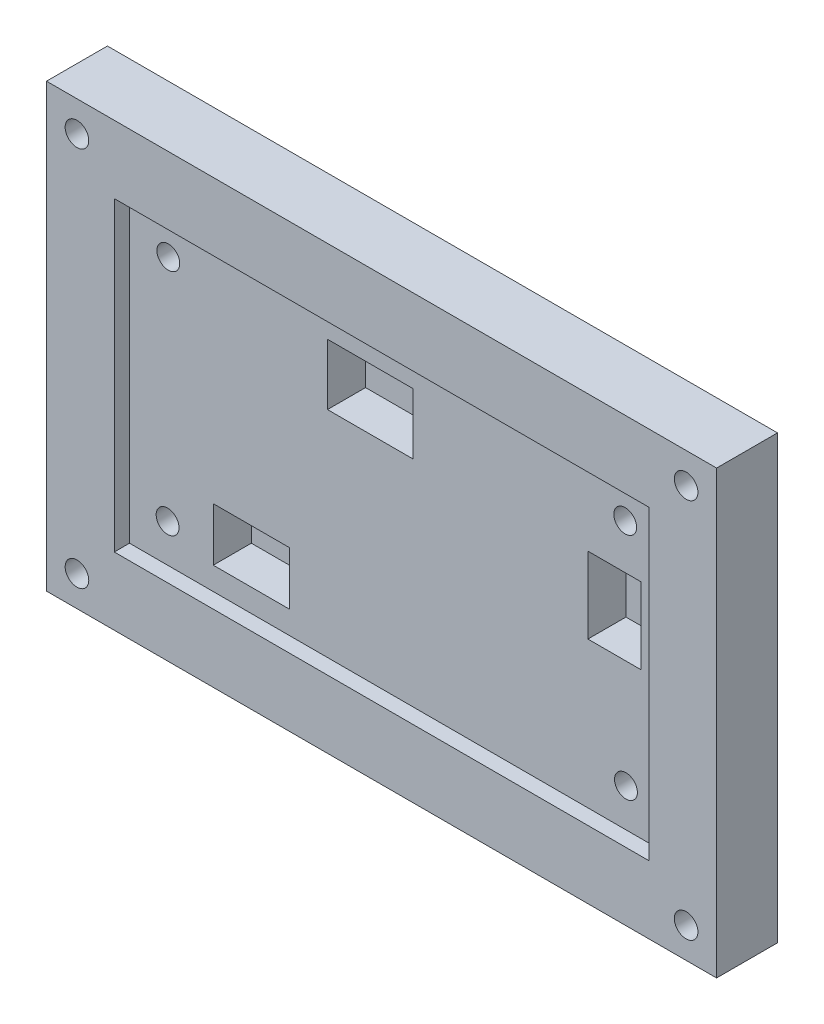
ISO-10303-21;
HEADER;
FILE_DESCRIPTION(('STEP AP214'),'2;1');
FILE_NAME('part.step','',(''),(''),'','','');
FILE_SCHEMA(('AUTOMOTIVE_DESIGN { 1 0 10303 214 1 1 1 1 }'));
ENDSEC;
DATA;
#1=APPLICATION_CONTEXT('core data for automotive mechanical design processes');
#2=APPLICATION_PROTOCOL_DEFINITION('international standard','automotive_design',2000,#1);
#3=PRODUCT_CONTEXT('',#1,'mechanical');
#4=PRODUCT('Part','Part','',(#3));
#5=PRODUCT_RELATED_PRODUCT_CATEGORY('part','',(#4));
#6=PRODUCT_DEFINITION_FORMATION('','',#4);
#7=PRODUCT_DEFINITION_CONTEXT('part definition',#1,'design');
#8=PRODUCT_DEFINITION('design','',#6,#7);
#9=PRODUCT_DEFINITION_SHAPE('','',#8);
#10=(LENGTH_UNIT() NAMED_UNIT(*) SI_UNIT(.MILLI.,.METRE.));
#11=(NAMED_UNIT(*) PLANE_ANGLE_UNIT() SI_UNIT($,.RADIAN.));
#12=(NAMED_UNIT(*) SI_UNIT($,.STERADIAN.) SOLID_ANGLE_UNIT());
#13=UNCERTAINTY_MEASURE_WITH_UNIT(LENGTH_MEASURE(1.E-05),#10,'distance_accuracy_value','');
#14=(GEOMETRIC_REPRESENTATION_CONTEXT(3) GLOBAL_UNCERTAINTY_ASSIGNED_CONTEXT((#13)) GLOBAL_UNIT_ASSIGNED_CONTEXT((#10,
#11,#12)) REPRESENTATION_CONTEXT('',''));
#15=CARTESIAN_POINT('',(0.,0.,0.));
#16=DIRECTION('',(0.,0.,1.));
#17=DIRECTION('',(1.,0.,0.));
#18=AXIS2_PLACEMENT_3D('',#15,#16,#17);
#19=CARTESIAN_POINT('',(0.,0.,8.));
#20=DIRECTION('',(0.,0.,1.));
#21=DIRECTION('',(1.,0.,0.));
#22=AXIS2_PLACEMENT_3D('',#19,#20,#21);
#23=PLANE('',#22);
#24=DIRECTION('',(-1.,0.,0.));
#25=VECTOR('',#24,1.);
#26=CARTESIAN_POINT('',(79.1,49.1,8.));
#27=LINE('',#26,#25);
#28=CARTESIAN_POINT('',(79.1,49.1,8.));
#29=VERTEX_POINT('',#28);
#30=CARTESIAN_POINT('',(8.9,49.1,8.));
#31=VERTEX_POINT('',#30);
#32=EDGE_CURVE('E297',#29,#31,#27,.T.);
#33=ORIENTED_EDGE('',*,*,#32,.F.);
#34=DIRECTION('',(0.,1.,0.));
#35=VECTOR('',#34,1.);
#36=CARTESIAN_POINT('',(79.1,8.9,8.));
#37=LINE('',#36,#35);
#38=CARTESIAN_POINT('',(79.1,8.9,8.));
#39=VERTEX_POINT('',#38);
#40=EDGE_CURVE('E304',#39,#29,#37,.T.);
#41=ORIENTED_EDGE('',*,*,#40,.F.);
#42=DIRECTION('',(1.,0.,0.));
#43=VECTOR('',#42,1.);
#44=CARTESIAN_POINT('',(8.9,8.9,8.));
#45=LINE('',#44,#43);
#46=CARTESIAN_POINT('',(8.9,8.9,8.));
#47=VERTEX_POINT('',#46);
#48=EDGE_CURVE('E318',#47,#39,#45,.T.);
#49=ORIENTED_EDGE('',*,*,#48,.F.);
#50=DIRECTION('',(0.,-1.,0.));
#51=VECTOR('',#50,1.);
#52=CARTESIAN_POINT('',(8.9,49.1,8.));
#53=LINE('',#52,#51);
#54=EDGE_CURVE('E315',#31,#47,#53,.T.);
#55=ORIENTED_EDGE('',*,*,#54,.F.);
#56=EDGE_LOOP('',(#33,#41,#49,#55));
#57=FACE_BOUND('',#56,.T.);
#58=CARTESIAN_POINT('',(84.,4.00000000000001,8.));
#59=DIRECTION('',(0.,0.,1.));
#60=DIRECTION('',(-1.,0.,0.));
#61=AXIS2_PLACEMENT_3D('',#58,#59,#60);
#62=CIRCLE('',#61,1.54999999999999);
#63=CARTESIAN_POINT('',(82.45,4.00000000000001,8.));
#64=VERTEX_POINT('',#63);
#65=EDGE_CURVE('E338',#64,#64,#62,.T.);
#66=ORIENTED_EDGE('',*,*,#65,.F.);
#67=EDGE_LOOP('',(#66));
#68=FACE_BOUND('',#67,.T.);
#69=CARTESIAN_POINT('',(4.00000000000001,4.,8.));
#70=DIRECTION('',(0.,0.,1.));
#71=DIRECTION('',(1.,0.,0.));
#72=AXIS2_PLACEMENT_3D('',#69,#70,#71);
#73=CIRCLE('',#72,1.55);
#74=CARTESIAN_POINT('',(5.55000000000001,4.,8.));
#75=VERTEX_POINT('',#74);
#76=EDGE_CURVE('E350',#75,#75,#73,.T.);
#77=ORIENTED_EDGE('',*,*,#76,.F.);
#78=EDGE_LOOP('',(#77));
#79=FACE_BOUND('',#78,.T.);
#80=DIRECTION('',(0.,-1.,0.));
#81=VECTOR('',#80,1.);
#82=CARTESIAN_POINT('',(0.,58.,8.));
#83=LINE('',#82,#81);
#84=CARTESIAN_POINT('',(0.,58.,8.));
#85=VERTEX_POINT('',#84);
#86=CARTESIAN_POINT('',(0.,0.,8.));
#87=VERTEX_POINT('',#86);
#88=EDGE_CURVE('E356',#85,#87,#83,.T.);
#89=ORIENTED_EDGE('',*,*,#88,.T.);
#90=DIRECTION('',(1.,0.,0.));
#91=VECTOR('',#90,1.);
#92=CARTESIAN_POINT('',(0.,0.,8.));
#93=LINE('',#92,#91);
#94=CARTESIAN_POINT('',(88.,0.,8.));
#95=VERTEX_POINT('',#94);
#96=EDGE_CURVE('E359',#87,#95,#93,.T.);
#97=ORIENTED_EDGE('',*,*,#96,.T.);
#98=DIRECTION('',(0.,1.,0.));
#99=VECTOR('',#98,1.);
#100=CARTESIAN_POINT('',(88.,58.,8.));
#101=LINE('',#100,#99);
#102=CARTESIAN_POINT('',(88.,58.,8.));
#103=VERTEX_POINT('',#102);
#104=EDGE_CURVE('E362',#95,#103,#101,.T.);
#105=ORIENTED_EDGE('',*,*,#104,.T.);
#106=DIRECTION('',(-1.,0.,0.));
#107=VECTOR('',#106,1.);
#108=CARTESIAN_POINT('',(0.,58.,8.));
#109=LINE('',#108,#107);
#110=EDGE_CURVE('E364',#103,#85,#109,.T.);
#111=ORIENTED_EDGE('',*,*,#110,.T.);
#112=EDGE_LOOP('',(#89,#97,#105,#111));
#113=FACE_BOUND('',#112,.T.);
#114=CARTESIAN_POINT('',(4.00000000000001,54.,8.));
#115=DIRECTION('',(0.,0.,1.));
#116=DIRECTION('',(-1.,0.,0.));
#117=AXIS2_PLACEMENT_3D('',#114,#115,#116);
#118=CIRCLE('',#117,1.55);
#119=CARTESIAN_POINT('',(2.45000000000001,54.,8.));
#120=VERTEX_POINT('',#119);
#121=EDGE_CURVE('E344',#120,#120,#118,.T.);
#122=ORIENTED_EDGE('',*,*,#121,.F.);
#123=EDGE_LOOP('',(#122));
#124=FACE_BOUND('',#123,.T.);
#125=CARTESIAN_POINT('',(84.,54.,8.));
#126=DIRECTION('',(0.,0.,1.));
#127=DIRECTION('',(1.,0.,0.));
#128=AXIS2_PLACEMENT_3D('',#125,#126,#127);
#129=CIRCLE('',#128,1.54999999999999);
#130=CARTESIAN_POINT('',(85.55,54.,8.));
#131=VERTEX_POINT('',#130);
#132=EDGE_CURVE('E332',#131,#131,#129,.T.);
#133=ORIENTED_EDGE('',*,*,#132,.F.);
#134=EDGE_LOOP('',(#133));
#135=FACE_BOUND('',#134,.T.);
#136=ADVANCED_FACE('F41',(#57,#68,#79,#113,#124,#135),#23,.T.);
#137=CARTESIAN_POINT('',(0.,0.,0.));
#138=DIRECTION('',(0.,0.,1.));
#139=DIRECTION('',(1.,0.,0.));
#140=AXIS2_PLACEMENT_3D('',#137,#138,#139);
#141=PLANE('',#140);
#142=DIRECTION('',(0.,-1.,0.));
#143=VECTOR('',#142,1.);
#144=CARTESIAN_POINT('',(0.,58.,0.));
#145=LINE('',#144,#143);
#146=CARTESIAN_POINT('',(0.,58.,0.));
#147=VERTEX_POINT('',#146);
#148=CARTESIAN_POINT('',(0.,0.,0.));
#149=VERTEX_POINT('',#148);
#150=EDGE_CURVE('E353',#147,#149,#145,.T.);
#151=ORIENTED_EDGE('',*,*,#150,.F.);
#152=DIRECTION('',(-1.,0.,0.));
#153=VECTOR('',#152,1.);
#154=CARTESIAN_POINT('',(0.,58.,0.));
#155=LINE('',#154,#153);
#156=CARTESIAN_POINT('',(88.,58.,0.));
#157=VERTEX_POINT('',#156);
#158=EDGE_CURVE('E360',#157,#147,#155,.T.);
#159=ORIENTED_EDGE('',*,*,#158,.F.);
#160=DIRECTION('',(0.,1.,0.));
#161=VECTOR('',#160,1.);
#162=CARTESIAN_POINT('',(88.,58.,0.));
#163=LINE('',#162,#161);
#164=CARTESIAN_POINT('',(88.,0.,0.));
#165=VERTEX_POINT('',#164);
#166=EDGE_CURVE('E371',#165,#157,#163,.T.);
#167=ORIENTED_EDGE('',*,*,#166,.F.);
#168=DIRECTION('',(1.,0.,0.));
#169=VECTOR('',#168,1.);
#170=CARTESIAN_POINT('',(0.,0.,0.));
#171=LINE('',#170,#169);
#172=EDGE_CURVE('E369',#149,#165,#171,.T.);
#173=ORIENTED_EDGE('',*,*,#172,.F.);
#174=EDGE_LOOP('',(#151,#159,#167,#173));
#175=FACE_BOUND('',#174,.T.);
#176=CARTESIAN_POINT('',(4.00000000000001,4.,0.));
#177=DIRECTION('',(0.,0.,1.));
#178=DIRECTION('',(1.,0.,0.));
#179=AXIS2_PLACEMENT_3D('',#176,#177,#178);
#180=CIRCLE('',#179,1.55);
#181=CARTESIAN_POINT('',(5.55000000000001,4.,0.));
#182=VERTEX_POINT('',#181);
#183=EDGE_CURVE('E347',#182,#182,#180,.T.);
#184=ORIENTED_EDGE('',*,*,#183,.T.);
#185=EDGE_LOOP('',(#184));
#186=FACE_BOUND('',#185,.T.);
#187=CARTESIAN_POINT('',(4.00000000000001,54.,0.));
#188=DIRECTION('',(0.,0.,1.));
#189=DIRECTION('',(-1.,0.,0.));
#190=AXIS2_PLACEMENT_3D('',#187,#188,#189);
#191=CIRCLE('',#190,1.55);
#192=CARTESIAN_POINT('',(2.45000000000001,54.,0.));
#193=VERTEX_POINT('',#192);
#194=EDGE_CURVE('E341',#193,#193,#191,.T.);
#195=ORIENTED_EDGE('',*,*,#194,.T.);
#196=EDGE_LOOP('',(#195));
#197=FACE_BOUND('',#196,.T.);
#198=CARTESIAN_POINT('',(84.,4.00000000000001,0.));
#199=DIRECTION('',(0.,0.,1.));
#200=DIRECTION('',(-1.,0.,0.));
#201=AXIS2_PLACEMENT_3D('',#198,#199,#200);
#202=CIRCLE('',#201,1.54999999999999);
#203=CARTESIAN_POINT('',(82.45,4.00000000000001,0.));
#204=VERTEX_POINT('',#203);
#205=EDGE_CURVE('E335',#204,#204,#202,.T.);
#206=ORIENTED_EDGE('',*,*,#205,.T.);
#207=EDGE_LOOP('',(#206));
#208=FACE_BOUND('',#207,.T.);
#209=CARTESIAN_POINT('',(84.,54.,0.));
#210=DIRECTION('',(0.,0.,1.));
#211=DIRECTION('',(1.,0.,0.));
#212=AXIS2_PLACEMENT_3D('',#209,#210,#211);
#213=CIRCLE('',#212,1.54999999999999);
#214=CARTESIAN_POINT('',(85.55,54.,0.));
#215=VERTEX_POINT('',#214);
#216=EDGE_CURVE('E325',#215,#215,#213,.T.);
#217=ORIENTED_EDGE('',*,*,#216,.T.);
#218=EDGE_LOOP('',(#217));
#219=FACE_BOUND('',#218,.T.);
#220=ADVANCED_FACE('F389',(#175,#186,#197,#208,#219),#141,.F.);
#221=CARTESIAN_POINT('',(0.,58.,8.));
#222=DIRECTION('',(1.,0.,0.));
#223=DIRECTION('',(0.,1.,0.));
#224=AXIS2_PLACEMENT_3D('',#221,#222,#223);
#225=PLANE('',#224);
#226=ORIENTED_EDGE('',*,*,#150,.T.);
#227=DIRECTION('',(0.,0.,-1.));
#228=VECTOR('',#227,1.);
#229=CARTESIAN_POINT('',(0.,0.,8.));
#230=LINE('',#229,#228);
#231=EDGE_CURVE('E11',#87,#149,#230,.T.);
#232=ORIENTED_EDGE('',*,*,#231,.F.);
#233=ORIENTED_EDGE('',*,*,#88,.F.);
#234=DIRECTION('',(0.,0.,-1.));
#235=VECTOR('',#234,1.);
#236=CARTESIAN_POINT('',(0.,58.,8.));
#237=LINE('',#236,#235);
#238=EDGE_CURVE('E366',#85,#147,#237,.T.);
#239=ORIENTED_EDGE('',*,*,#238,.T.);
#240=EDGE_LOOP('',(#226,#232,#233,#239));
#241=FACE_BOUND('',#240,.T.);
#242=ADVANCED_FACE('F43',(#241),#225,.F.);
#243=CARTESIAN_POINT('',(0.,0.,8.));
#244=DIRECTION('',(0.,1.,0.));
#245=DIRECTION('',(0.,0.,1.));
#246=AXIS2_PLACEMENT_3D('',#243,#244,#245);
#247=PLANE('',#246);
#248=ORIENTED_EDGE('',*,*,#172,.T.);
#249=DIRECTION('',(0.,0.,-1.));
#250=VECTOR('',#249,1.);
#251=CARTESIAN_POINT('',(88.,0.,8.));
#252=LINE('',#251,#250);
#253=EDGE_CURVE('E49',#95,#165,#252,.T.);
#254=ORIENTED_EDGE('',*,*,#253,.F.);
#255=ORIENTED_EDGE('',*,*,#96,.F.);
#256=ORIENTED_EDGE('',*,*,#231,.T.);
#257=EDGE_LOOP('',(#248,#254,#255,#256));
#258=FACE_BOUND('',#257,.T.);
#259=ADVANCED_FACE('F400',(#258),#247,.F.);
#260=CARTESIAN_POINT('',(88.,58.,8.));
#261=DIRECTION('',(-1.,0.,0.));
#262=DIRECTION('',(0.,0.,1.));
#263=AXIS2_PLACEMENT_3D('',#260,#261,#262);
#264=PLANE('',#263);
#265=ORIENTED_EDGE('',*,*,#166,.T.);
#266=DIRECTION('',(0.,0.,-1.));
#267=VECTOR('',#266,1.);
#268=CARTESIAN_POINT('',(88.,58.,8.));
#269=LINE('',#268,#267);
#270=EDGE_CURVE('E376',#103,#157,#269,.T.);
#271=ORIENTED_EDGE('',*,*,#270,.F.);
#272=ORIENTED_EDGE('',*,*,#104,.F.);
#273=ORIENTED_EDGE('',*,*,#253,.T.);
#274=EDGE_LOOP('',(#265,#271,#272,#273));
#275=FACE_BOUND('',#274,.T.);
#276=ADVANCED_FACE('F383',(#275),#264,.F.);
#277=CARTESIAN_POINT('',(0.,58.,8.));
#278=DIRECTION('',(0.,-1.,0.));
#279=DIRECTION('',(0.,0.,-1.));
#280=AXIS2_PLACEMENT_3D('',#277,#278,#279);
#281=PLANE('',#280);
#282=ORIENTED_EDGE('',*,*,#158,.T.);
#283=ORIENTED_EDGE('',*,*,#238,.F.);
#284=ORIENTED_EDGE('',*,*,#110,.F.);
#285=ORIENTED_EDGE('',*,*,#270,.T.);
#286=EDGE_LOOP('',(#282,#283,#284,#285));
#287=FACE_BOUND('',#286,.T.);
#288=ADVANCED_FACE('F393',(#287),#281,.F.);
#289=CARTESIAN_POINT('',(4.00000000000001,4.,8.));
#290=DIRECTION('',(0.,0.,-1.));
#291=DIRECTION('',(-1.,0.,0.));
#292=AXIS2_PLACEMENT_3D('',#289,#290,#291);
#293=CYLINDRICAL_SURFACE('',#292,1.55);
#294=ORIENTED_EDGE('',*,*,#76,.T.);
#295=EDGE_LOOP('',(#294));
#296=FACE_BOUND('',#295,.T.);
#297=ORIENTED_EDGE('',*,*,#183,.F.);
#298=EDGE_LOOP('',(#297));
#299=FACE_BOUND('',#298,.T.);
#300=ADVANCED_FACE('F419',(#296,#299),#293,.F.);
#301=CARTESIAN_POINT('',(4.00000000000001,54.,8.));
#302=DIRECTION('',(0.,0.,-1.));
#303=DIRECTION('',(-1.,0.,0.));
#304=AXIS2_PLACEMENT_3D('',#301,#302,#303);
#305=CYLINDRICAL_SURFACE('',#304,1.55);
#306=ORIENTED_EDGE('',*,*,#121,.T.);
#307=EDGE_LOOP('',(#306));
#308=FACE_BOUND('',#307,.T.);
#309=ORIENTED_EDGE('',*,*,#194,.F.);
#310=EDGE_LOOP('',(#309));
#311=FACE_BOUND('',#310,.T.);
#312=ADVANCED_FACE('F426',(#308,#311),#305,.F.);
#313=CARTESIAN_POINT('',(84.,4.00000000000001,8.));
#314=DIRECTION('',(0.,0.,-1.));
#315=DIRECTION('',(-1.,0.,0.));
#316=AXIS2_PLACEMENT_3D('',#313,#314,#315);
#317=CYLINDRICAL_SURFACE('',#316,1.54999999999999);
#318=ORIENTED_EDGE('',*,*,#65,.T.);
#319=EDGE_LOOP('',(#318));
#320=FACE_BOUND('',#319,.T.);
#321=ORIENTED_EDGE('',*,*,#205,.F.);
#322=EDGE_LOOP('',(#321));
#323=FACE_BOUND('',#322,.T.);
#324=ADVANCED_FACE('F431',(#320,#323),#317,.F.);
#325=CARTESIAN_POINT('',(84.,54.,8.));
#326=DIRECTION('',(0.,0.,-1.));
#327=DIRECTION('',(-1.,0.,0.));
#328=AXIS2_PLACEMENT_3D('',#325,#326,#327);
#329=CYLINDRICAL_SURFACE('',#328,1.54999999999999);
#330=ORIENTED_EDGE('',*,*,#132,.T.);
#331=EDGE_LOOP('',(#330));
#332=FACE_BOUND('',#331,.T.);
#333=ORIENTED_EDGE('',*,*,#216,.F.);
#334=EDGE_LOOP('',(#333));
#335=FACE_BOUND('',#334,.T.);
#336=ADVANCED_FACE('F443',(#332,#335),#329,.F.);
#337=CARTESIAN_POINT('',(79.1,49.1,6.));
#338=DIRECTION('',(0.,1.,0.));
#339=DIRECTION('',(0.,0.,1.));
#340=AXIS2_PLACEMENT_3D('',#337,#338,#339);
#341=PLANE('',#340);
#342=ORIENTED_EDGE('',*,*,#32,.T.);
#343=DIRECTION('',(0.,0.,1.));
#344=VECTOR('',#343,1.);
#345=CARTESIAN_POINT('',(8.9,49.1,6.));
#346=LINE('',#345,#344);
#347=CARTESIAN_POINT('',(8.9,49.1,6.));
#348=VERTEX_POINT('',#347);
#349=EDGE_CURVE('E313',#348,#31,#346,.T.);
#350=ORIENTED_EDGE('',*,*,#349,.F.);
#351=DIRECTION('',(-1.,0.,0.));
#352=VECTOR('',#351,1.);
#353=CARTESIAN_POINT('',(79.1,49.1,6.));
#354=LINE('',#353,#352);
#355=CARTESIAN_POINT('',(79.1,49.1,6.));
#356=VERTEX_POINT('',#355);
#357=EDGE_CURVE('E300',#356,#348,#354,.T.);
#358=ORIENTED_EDGE('',*,*,#357,.F.);
#359=DIRECTION('',(0.,0.,1.));
#360=VECTOR('',#359,1.);
#361=CARTESIAN_POINT('',(79.1,49.1,6.));
#362=LINE('',#361,#360);
#363=EDGE_CURVE('E323',#356,#29,#362,.T.);
#364=ORIENTED_EDGE('',*,*,#363,.T.);
#365=EDGE_LOOP('',(#342,#350,#358,#364));
#366=FACE_BOUND('',#365,.T.);
#367=ADVANCED_FACE('F444',(#366),#341,.F.);
#368=CARTESIAN_POINT('',(79.1,8.9,6.));
#369=DIRECTION('',(1.,0.,0.));
#370=DIRECTION('',(0.,0.,-1.));
#371=AXIS2_PLACEMENT_3D('',#368,#369,#370);
#372=PLANE('',#371);
#373=ORIENTED_EDGE('',*,*,#40,.T.);
#374=ORIENTED_EDGE('',*,*,#363,.F.);
#375=DIRECTION('',(0.,1.,0.));
#376=VECTOR('',#375,1.);
#377=CARTESIAN_POINT('',(79.1,8.9,6.));
#378=LINE('',#377,#376);
#379=CARTESIAN_POINT('',(79.1,8.9,6.));
#380=VERTEX_POINT('',#379);
#381=EDGE_CURVE('E310',#380,#356,#378,.T.);
#382=ORIENTED_EDGE('',*,*,#381,.F.);
#383=DIRECTION('',(0.,0.,1.));
#384=VECTOR('',#383,1.);
#385=CARTESIAN_POINT('',(79.1,8.9,6.));
#386=LINE('',#385,#384);
#387=EDGE_CURVE('E326',#380,#39,#386,.T.);
#388=ORIENTED_EDGE('',*,*,#387,.T.);
#389=EDGE_LOOP('',(#373,#374,#382,#388));
#390=FACE_BOUND('',#389,.T.);
#391=ADVANCED_FACE('F450',(#390),#372,.F.);
#392=CARTESIAN_POINT('',(8.9,8.9,6.));
#393=DIRECTION('',(0.,-1.,0.));
#394=DIRECTION('',(0.,0.,-1.));
#395=AXIS2_PLACEMENT_3D('',#392,#393,#394);
#396=PLANE('',#395);
#397=ORIENTED_EDGE('',*,*,#48,.T.);
#398=ORIENTED_EDGE('',*,*,#387,.F.);
#399=DIRECTION('',(1.,0.,0.));
#400=VECTOR('',#399,1.);
#401=CARTESIAN_POINT('',(8.9,8.9,6.));
#402=LINE('',#401,#400);
#403=CARTESIAN_POINT('',(8.9,8.9,6.));
#404=VERTEX_POINT('',#403);
#405=EDGE_CURVE('E307',#404,#380,#402,.T.);
#406=ORIENTED_EDGE('',*,*,#405,.F.);
#407=DIRECTION('',(0.,0.,1.));
#408=VECTOR('',#407,1.);
#409=CARTESIAN_POINT('',(8.9,8.9,6.));
#410=LINE('',#409,#408);
#411=EDGE_CURVE('E328',#404,#47,#410,.T.);
#412=ORIENTED_EDGE('',*,*,#411,.T.);
#413=EDGE_LOOP('',(#397,#398,#406,#412));
#414=FACE_BOUND('',#413,.T.);
#415=ADVANCED_FACE('F459',(#414),#396,.F.);
#416=CARTESIAN_POINT('',(8.9,49.1,6.));
#417=DIRECTION('',(-1.,0.,0.));
#418=DIRECTION('',(0.,-1.,0.));
#419=AXIS2_PLACEMENT_3D('',#416,#417,#418);
#420=PLANE('',#419);
#421=ORIENTED_EDGE('',*,*,#54,.T.);
#422=ORIENTED_EDGE('',*,*,#411,.F.);
#423=DIRECTION('',(0.,-1.,0.));
#424=VECTOR('',#423,1.);
#425=CARTESIAN_POINT('',(8.9,49.1,6.));
#426=LINE('',#425,#424);
#427=EDGE_CURVE('E303',#348,#404,#426,.T.);
#428=ORIENTED_EDGE('',*,*,#427,.F.);
#429=ORIENTED_EDGE('',*,*,#349,.T.);
#430=EDGE_LOOP('',(#421,#422,#428,#429));
#431=FACE_BOUND('',#430,.T.);
#432=ADVANCED_FACE('F456',(#431),#420,.F.);
#433=CARTESIAN_POINT('',(0.,0.,6.));
#434=DIRECTION('',(0.,0.,1.));
#435=DIRECTION('',(1.,0.,0.));
#436=AXIS2_PLACEMENT_3D('',#433,#434,#435);
#437=PLANE('',#436);
#438=DIRECTION('',(0.,-1.,0.));
#439=VECTOR('',#438,1.);
#440=CARTESIAN_POINT('',(19.9,18.9,6.));
#441=LINE('',#440,#439);
#442=CARTESIAN_POINT('',(19.9,18.9,6.));
#443=VERTEX_POINT('',#442);
#444=CARTESIAN_POINT('',(19.9,11.9,6.));
#445=VERTEX_POINT('',#444);
#446=EDGE_CURVE('E56',#443,#445,#441,.T.);
#447=ORIENTED_EDGE('',*,*,#446,.F.);
#448=DIRECTION('',(-1.,0.,0.));
#449=VECTOR('',#448,1.);
#450=CARTESIAN_POINT('',(19.9,18.9,6.));
#451=LINE('',#450,#449);
#452=CARTESIAN_POINT('',(29.9,18.9,6.));
#453=VERTEX_POINT('',#452);
#454=EDGE_CURVE('E261',#453,#443,#451,.T.);
#455=ORIENTED_EDGE('',*,*,#454,.F.);
#456=DIRECTION('',(0.,1.,0.));
#457=VECTOR('',#456,1.);
#458=CARTESIAN_POINT('',(29.9,18.9,6.));
#459=LINE('',#458,#457);
#460=CARTESIAN_POINT('',(29.9,11.9,6.));
#461=VERTEX_POINT('',#460);
#462=EDGE_CURVE('E264',#461,#453,#459,.T.);
#463=ORIENTED_EDGE('',*,*,#462,.F.);
#464=DIRECTION('',(1.,0.,0.));
#465=VECTOR('',#464,1.);
#466=CARTESIAN_POINT('',(19.9,11.9,6.));
#467=LINE('',#466,#465);
#468=EDGE_CURVE('E268',#445,#461,#467,.T.);
#469=ORIENTED_EDGE('',*,*,#468,.F.);
#470=EDGE_LOOP('',(#447,#455,#463,#469));
#471=FACE_BOUND('',#470,.T.);
#472=CARTESIAN_POINT('',(74.,44.,6.));
#473=DIRECTION('',(0.,0.,1.));
#474=DIRECTION('',(1.,0.,0.));
#475=AXIS2_PLACEMENT_3D('',#472,#473,#474);
#476=CIRCLE('',#475,1.5);
#477=CARTESIAN_POINT('',(75.5,44.,6.));
#478=VERTEX_POINT('',#477);
#479=EDGE_CURVE('E248',#478,#478,#476,.T.);
#480=ORIENTED_EDGE('',*,*,#479,.F.);
#481=EDGE_LOOP('',(#480));
#482=FACE_BOUND('',#481,.T.);
#483=CARTESIAN_POINT('',(74.1,13.9,6.));
#484=DIRECTION('',(0.,0.,1.));
#485=DIRECTION('',(-1.,0.,0.));
#486=AXIS2_PLACEMENT_3D('',#483,#484,#485);
#487=CIRCLE('',#486,1.5);
#488=CARTESIAN_POINT('',(72.6,13.9,6.));
#489=VERTEX_POINT('',#488);
#490=EDGE_CURVE('E289',#489,#489,#487,.T.);
#491=ORIENTED_EDGE('',*,*,#490,.F.);
#492=EDGE_LOOP('',(#491));
#493=FACE_BOUND('',#492,.T.);
#494=CARTESIAN_POINT('',(14.,44.,6.));
#495=DIRECTION('',(0.,0.,1.));
#496=DIRECTION('',(-1.,0.,0.));
#497=AXIS2_PLACEMENT_3D('',#494,#495,#496);
#498=CIRCLE('',#497,1.5);
#499=CARTESIAN_POINT('',(12.5,44.,6.));
#500=VERTEX_POINT('',#499);
#501=EDGE_CURVE('E282',#500,#500,#498,.T.);
#502=ORIENTED_EDGE('',*,*,#501,.F.);
#503=EDGE_LOOP('',(#502));
#504=FACE_BOUND('',#503,.T.);
#505=DIRECTION('',(0.,-1.,0.));
#506=VECTOR('',#505,1.);
#507=CARTESIAN_POINT('',(69.1,38.1,6.));
#508=LINE('',#507,#506);
#509=CARTESIAN_POINT('',(69.1,38.1,6.));
#510=VERTEX_POINT('',#509);
#511=CARTESIAN_POINT('',(69.1,28.1,6.));
#512=VERTEX_POINT('',#511);
#513=EDGE_CURVE('E64',#510,#512,#508,.T.);
#514=ORIENTED_EDGE('',*,*,#513,.F.);
#515=DIRECTION('',(-1.,0.,0.));
#516=VECTOR('',#515,1.);
#517=CARTESIAN_POINT('',(69.1,38.1,6.));
#518=LINE('',#517,#516);
#519=CARTESIAN_POINT('',(76.1,38.1,6.));
#520=VERTEX_POINT('',#519);
#521=EDGE_CURVE('E188',#520,#510,#518,.T.);
#522=ORIENTED_EDGE('',*,*,#521,.F.);
#523=DIRECTION('',(0.,1.,0.));
#524=VECTOR('',#523,1.);
#525=CARTESIAN_POINT('',(76.1,38.1,6.));
#526=LINE('',#525,#524);
#527=CARTESIAN_POINT('',(76.1,28.1,6.));
#528=VERTEX_POINT('',#527);
#529=EDGE_CURVE('E193',#528,#520,#526,.T.);
#530=ORIENTED_EDGE('',*,*,#529,.F.);
#531=DIRECTION('',(1.,0.,0.));
#532=VECTOR('',#531,1.);
#533=CARTESIAN_POINT('',(69.1,28.1,6.));
#534=LINE('',#533,#532);
#535=EDGE_CURVE('E199',#512,#528,#534,.T.);
#536=ORIENTED_EDGE('',*,*,#535,.F.);
#537=EDGE_LOOP('',(#514,#522,#530,#536));
#538=FACE_BOUND('',#537,.T.);
#539=DIRECTION('',(0.,-1.,0.));
#540=VECTOR('',#539,1.);
#541=CARTESIAN_POINT('',(34.9,45.1,6.));
#542=LINE('',#541,#540);
#543=CARTESIAN_POINT('',(34.9,45.1,6.));
#544=VERTEX_POINT('',#543);
#545=CARTESIAN_POINT('',(34.9,37.1,6.));
#546=VERTEX_POINT('',#545);
#547=EDGE_CURVE('E185',#544,#546,#542,.T.);
#548=ORIENTED_EDGE('',*,*,#547,.F.);
#549=DIRECTION('',(-1.,0.,0.));
#550=VECTOR('',#549,1.);
#551=CARTESIAN_POINT('',(34.9,45.1,6.));
#552=LINE('',#551,#550);
#553=CARTESIAN_POINT('',(46.1,45.1,6.));
#554=VERTEX_POINT('',#553);
#555=EDGE_CURVE('E227',#554,#544,#552,.T.);
#556=ORIENTED_EDGE('',*,*,#555,.F.);
#557=DIRECTION('',(0.,1.,0.));
#558=VECTOR('',#557,1.);
#559=CARTESIAN_POINT('',(46.1,45.1,6.));
#560=LINE('',#559,#558);
#561=CARTESIAN_POINT('',(46.1,37.1,6.));
#562=VERTEX_POINT('',#561);
#563=EDGE_CURVE('E230',#562,#554,#560,.T.);
#564=ORIENTED_EDGE('',*,*,#563,.F.);
#565=DIRECTION('',(1.,0.,0.));
#566=VECTOR('',#565,1.);
#567=CARTESIAN_POINT('',(34.9,37.1,6.));
#568=LINE('',#567,#566);
#569=EDGE_CURVE('E234',#546,#562,#568,.T.);
#570=ORIENTED_EDGE('',*,*,#569,.F.);
#571=EDGE_LOOP('',(#548,#556,#564,#570));
#572=FACE_BOUND('',#571,.T.);
#573=CARTESIAN_POINT('',(13.9,13.9,6.));
#574=DIRECTION('',(0.,0.,1.));
#575=DIRECTION('',(1.,0.,0.));
#576=AXIS2_PLACEMENT_3D('',#573,#574,#575);
#577=CIRCLE('',#576,1.5);
#578=CARTESIAN_POINT('',(15.4,13.9,6.));
#579=VERTEX_POINT('',#578);
#580=EDGE_CURVE('E285',#579,#579,#577,.T.);
#581=ORIENTED_EDGE('',*,*,#580,.F.);
#582=EDGE_LOOP('',(#581));
#583=FACE_BOUND('',#582,.T.);
#584=ORIENTED_EDGE('',*,*,#357,.T.);
#585=ORIENTED_EDGE('',*,*,#427,.T.);
#586=ORIENTED_EDGE('',*,*,#405,.T.);
#587=ORIENTED_EDGE('',*,*,#381,.T.);
#588=EDGE_LOOP('',(#584,#585,#586,#587));
#589=FACE_BOUND('',#588,.T.);
#590=ADVANCED_FACE('F196',(#471,#482,#493,#504,#538,#572,#583,#589),#437,.T.);
#591=CARTESIAN_POINT('',(13.9,13.9,1.));
#592=DIRECTION('',(0.,0.,1.));
#593=DIRECTION('',(1.,0.,0.));
#594=AXIS2_PLACEMENT_3D('',#591,#592,#593);
#595=CYLINDRICAL_SURFACE('',#594,1.5);
#596=CARTESIAN_POINT('',(13.9,13.9,1.));
#597=DIRECTION('',(0.,0.,1.));
#598=DIRECTION('',(1.,0.,0.));
#599=AXIS2_PLACEMENT_3D('',#596,#597,#598);
#600=CIRCLE('',#599,1.5);
#601=CARTESIAN_POINT('',(15.4,13.9,1.));
#602=VERTEX_POINT('',#601);
#603=EDGE_CURVE('E294',#602,#602,#600,.T.);
#604=ORIENTED_EDGE('',*,*,#603,.F.);
#605=EDGE_LOOP('',(#604));
#606=FACE_BOUND('',#605,.T.);
#607=ORIENTED_EDGE('',*,*,#580,.T.);
#608=EDGE_LOOP('',(#607));
#609=FACE_BOUND('',#608,.T.);
#610=ADVANCED_FACE('F469',(#606,#609),#595,.F.);
#611=CARTESIAN_POINT('',(13.9,13.9,1.));
#612=DIRECTION('',(0.,0.,1.));
#613=DIRECTION('',(1.,0.,0.));
#614=AXIS2_PLACEMENT_3D('',#611,#612,#613);
#615=PLANE('',#614);
#616=ORIENTED_EDGE('',*,*,#603,.T.);
#617=EDGE_LOOP('',(#616));
#618=FACE_BOUND('',#617,.T.);
#619=ADVANCED_FACE('F473',(#618),#615,.T.);
#620=CARTESIAN_POINT('',(34.9,45.1,1.));
#621=DIRECTION('',(-1.,0.,0.));
#622=DIRECTION('',(0.,0.,1.));
#623=AXIS2_PLACEMENT_3D('',#620,#621,#622);
#624=PLANE('',#623);
#625=ORIENTED_EDGE('',*,*,#547,.T.);
#626=DIRECTION('',(0.,0.,1.));
#627=VECTOR('',#626,1.);
#628=CARTESIAN_POINT('',(34.9,37.1,1.));
#629=LINE('',#628,#627);
#630=CARTESIAN_POINT('',(34.9,37.1,1.));
#631=VERTEX_POINT('',#630);
#632=EDGE_CURVE('E217',#631,#546,#629,.T.);
#633=ORIENTED_EDGE('',*,*,#632,.F.);
#634=DIRECTION('',(0.,-1.,0.));
#635=VECTOR('',#634,1.);
#636=CARTESIAN_POINT('',(34.9,45.1,1.));
#637=LINE('',#636,#635);
#638=CARTESIAN_POINT('',(34.9,45.1,1.));
#639=VERTEX_POINT('',#638);
#640=EDGE_CURVE('E231',#639,#631,#637,.T.);
#641=ORIENTED_EDGE('',*,*,#640,.F.);
#642=DIRECTION('',(0.,0.,1.));
#643=VECTOR('',#642,1.);
#644=CARTESIAN_POINT('',(34.9,45.1,1.));
#645=LINE('',#644,#643);
#646=EDGE_CURVE('E225',#639,#544,#645,.T.);
#647=ORIENTED_EDGE('',*,*,#646,.T.);
#648=EDGE_LOOP('',(#625,#633,#641,#647));
#649=FACE_BOUND('',#648,.T.);
#650=ADVANCED_FACE('F477',(#649),#624,.F.);
#651=CARTESIAN_POINT('',(34.9,45.1,1.));
#652=DIRECTION('',(0.,1.,0.));
#653=DIRECTION('',(0.,0.,1.));
#654=AXIS2_PLACEMENT_3D('',#651,#652,#653);
#655=PLANE('',#654);
#656=ORIENTED_EDGE('',*,*,#555,.T.);
#657=ORIENTED_EDGE('',*,*,#646,.F.);
#658=DIRECTION('',(-1.,0.,0.));
#659=VECTOR('',#658,1.);
#660=CARTESIAN_POINT('',(34.9,45.1,1.));
#661=LINE('',#660,#659);
#662=CARTESIAN_POINT('',(46.1,45.1,1.));
#663=VERTEX_POINT('',#662);
#664=EDGE_CURVE('E220',#663,#639,#661,.T.);
#665=ORIENTED_EDGE('',*,*,#664,.F.);
#666=DIRECTION('',(0.,0.,1.));
#667=VECTOR('',#666,1.);
#668=CARTESIAN_POINT('',(46.1,45.1,1.));
#669=LINE('',#668,#667);
#670=EDGE_CURVE('E223',#663,#554,#669,.T.);
#671=ORIENTED_EDGE('',*,*,#670,.T.);
#672=EDGE_LOOP('',(#656,#657,#665,#671));
#673=FACE_BOUND('',#672,.T.);
#674=ADVANCED_FACE('F528',(#673),#655,.F.);
#675=CARTESIAN_POINT('',(46.1,45.1,1.));
#676=DIRECTION('',(1.,0.,0.));
#677=DIRECTION('',(0.,0.,-1.));
#678=AXIS2_PLACEMENT_3D('',#675,#676,#677);
#679=PLANE('',#678);
#680=ORIENTED_EDGE('',*,*,#563,.T.);
#681=ORIENTED_EDGE('',*,*,#670,.F.);
#682=DIRECTION('',(0.,1.,0.));
#683=VECTOR('',#682,1.);
#684=CARTESIAN_POINT('',(46.1,45.1,1.));
#685=LINE('',#684,#683);
#686=CARTESIAN_POINT('',(46.1,37.1,1.));
#687=VERTEX_POINT('',#686);
#688=EDGE_CURVE('E240',#687,#663,#685,.T.);
#689=ORIENTED_EDGE('',*,*,#688,.F.);
#690=DIRECTION('',(0.,0.,1.));
#691=VECTOR('',#690,1.);
#692=CARTESIAN_POINT('',(46.1,37.1,1.));
#693=LINE('',#692,#691);
#694=EDGE_CURVE('E221',#687,#562,#693,.T.);
#695=ORIENTED_EDGE('',*,*,#694,.T.);
#696=EDGE_LOOP('',(#680,#681,#689,#695));
#697=FACE_BOUND('',#696,.T.);
#698=ADVANCED_FACE('F531',(#697),#679,.F.);
#699=CARTESIAN_POINT('',(34.9,37.1,1.));
#700=DIRECTION('',(0.,-1.,0.));
#701=DIRECTION('',(0.,0.,-1.));
#702=AXIS2_PLACEMENT_3D('',#699,#700,#701);
#703=PLANE('',#702);
#704=ORIENTED_EDGE('',*,*,#569,.T.);
#705=ORIENTED_EDGE('',*,*,#694,.F.);
#706=DIRECTION('',(1.,0.,0.));
#707=VECTOR('',#706,1.);
#708=CARTESIAN_POINT('',(34.9,37.1,1.));
#709=LINE('',#708,#707);
#710=EDGE_CURVE('E243',#631,#687,#709,.T.);
#711=ORIENTED_EDGE('',*,*,#710,.F.);
#712=ORIENTED_EDGE('',*,*,#632,.T.);
#713=EDGE_LOOP('',(#704,#705,#711,#712));
#714=FACE_BOUND('',#713,.T.);
#715=ADVANCED_FACE('F526',(#714),#703,.F.);
#716=CARTESIAN_POINT('',(0.,0.,1.));
#717=DIRECTION('',(0.,0.,1.));
#718=DIRECTION('',(1.,0.,0.));
#719=AXIS2_PLACEMENT_3D('',#716,#717,#718);
#720=PLANE('',#719);
#721=ORIENTED_EDGE('',*,*,#640,.T.);
#722=ORIENTED_EDGE('',*,*,#710,.T.);
#723=ORIENTED_EDGE('',*,*,#688,.T.);
#724=ORIENTED_EDGE('',*,*,#664,.T.);
#725=EDGE_LOOP('',(#721,#722,#723,#724));
#726=FACE_BOUND('',#725,.T.);
#727=ADVANCED_FACE('F523',(#726),#720,.T.);
#728=CARTESIAN_POINT('',(69.1,38.1,1.));
#729=DIRECTION('',(-1.,0.,0.));
#730=DIRECTION('',(0.,0.,1.));
#731=AXIS2_PLACEMENT_3D('',#728,#729,#730);
#732=PLANE('',#731);
#733=ORIENTED_EDGE('',*,*,#513,.T.);
#734=DIRECTION('',(0.,0.,1.));
#735=VECTOR('',#734,1.);
#736=CARTESIAN_POINT('',(69.1,28.1,1.));
#737=LINE('',#736,#735);
#738=CARTESIAN_POINT('',(69.1,28.1,1.));
#739=VERTEX_POINT('',#738);
#740=EDGE_CURVE('E210',#739,#512,#737,.T.);
#741=ORIENTED_EDGE('',*,*,#740,.F.);
#742=DIRECTION('',(0.,-1.,0.));
#743=VECTOR('',#742,1.);
#744=CARTESIAN_POINT('',(69.1,38.1,1.));
#745=LINE('',#744,#743);
#746=CARTESIAN_POINT('',(69.1,38.1,1.));
#747=VERTEX_POINT('',#746);
#748=EDGE_CURVE('E180',#747,#739,#745,.T.);
#749=ORIENTED_EDGE('',*,*,#748,.F.);
#750=DIRECTION('',(0.,0.,1.));
#751=VECTOR('',#750,1.);
#752=CARTESIAN_POINT('',(69.1,38.1,1.));
#753=LINE('',#752,#751);
#754=EDGE_CURVE('E176',#747,#510,#753,.T.);
#755=ORIENTED_EDGE('',*,*,#754,.T.);
#756=EDGE_LOOP('',(#733,#741,#749,#755));
#757=FACE_BOUND('',#756,.T.);
#758=ADVANCED_FACE('F178',(#757),#732,.F.);
#759=CARTESIAN_POINT('',(69.1,38.1,1.));
#760=DIRECTION('',(0.,1.,0.));
#761=DIRECTION('',(0.,0.,1.));
#762=AXIS2_PLACEMENT_3D('',#759,#760,#761);
#763=PLANE('',#762);
#764=ORIENTED_EDGE('',*,*,#521,.T.);
#765=ORIENTED_EDGE('',*,*,#754,.F.);
#766=DIRECTION('',(-1.,0.,0.));
#767=VECTOR('',#766,1.);
#768=CARTESIAN_POINT('',(69.1,38.1,1.));
#769=LINE('',#768,#767);
#770=CARTESIAN_POINT('',(76.1,38.1,1.));
#771=VERTEX_POINT('',#770);
#772=EDGE_CURVE('E207',#771,#747,#769,.T.);
#773=ORIENTED_EDGE('',*,*,#772,.F.);
#774=DIRECTION('',(0.,0.,1.));
#775=VECTOR('',#774,1.);
#776=CARTESIAN_POINT('',(76.1,38.1,1.));
#777=LINE('',#776,#775);
#778=EDGE_CURVE('E184',#771,#520,#777,.T.);
#779=ORIENTED_EDGE('',*,*,#778,.T.);
#780=EDGE_LOOP('',(#764,#765,#773,#779));
#781=FACE_BOUND('',#780,.T.);
#782=ADVANCED_FACE('F189',(#781),#763,.F.);
#783=CARTESIAN_POINT('',(76.1,38.1,1.));
#784=DIRECTION('',(1.,0.,0.));
#785=DIRECTION('',(0.,0.,-1.));
#786=AXIS2_PLACEMENT_3D('',#783,#784,#785);
#787=PLANE('',#786);
#788=ORIENTED_EDGE('',*,*,#529,.T.);
#789=ORIENTED_EDGE('',*,*,#778,.F.);
#790=DIRECTION('',(0.,1.,0.));
#791=VECTOR('',#790,1.);
#792=CARTESIAN_POINT('',(76.1,38.1,1.));
#793=LINE('',#792,#791);
#794=CARTESIAN_POINT('',(76.1,28.1,1.));
#795=VERTEX_POINT('',#794);
#796=EDGE_CURVE('E209',#795,#771,#793,.T.);
#797=ORIENTED_EDGE('',*,*,#796,.F.);
#798=DIRECTION('',(0.,0.,1.));
#799=VECTOR('',#798,1.);
#800=CARTESIAN_POINT('',(76.1,28.1,1.));
#801=LINE('',#800,#799);
#802=EDGE_CURVE('E775',#795,#528,#801,.T.);
#803=ORIENTED_EDGE('',*,*,#802,.T.);
#804=EDGE_LOOP('',(#788,#789,#797,#803));
#805=FACE_BOUND('',#804,.T.);
#806=ADVANCED_FACE('F548',(#805),#787,.F.);
#807=CARTESIAN_POINT('',(69.1,28.1,1.));
#808=DIRECTION('',(0.,-1.,0.));
#809=DIRECTION('',(0.,0.,-1.));
#810=AXIS2_PLACEMENT_3D('',#807,#808,#809);
#811=PLANE('',#810);
#812=ORIENTED_EDGE('',*,*,#535,.T.);
#813=ORIENTED_EDGE('',*,*,#802,.F.);
#814=DIRECTION('',(1.,0.,0.));
#815=VECTOR('',#814,1.);
#816=CARTESIAN_POINT('',(69.1,28.1,1.));
#817=LINE('',#816,#815);
#818=EDGE_CURVE('E213',#739,#795,#817,.T.);
#819=ORIENTED_EDGE('',*,*,#818,.F.);
#820=ORIENTED_EDGE('',*,*,#740,.T.);
#821=EDGE_LOOP('',(#812,#813,#819,#820));
#822=FACE_BOUND('',#821,.T.);
#823=ADVANCED_FACE('F544',(#822),#811,.F.);
#824=CARTESIAN_POINT('',(0.,0.,1.));
#825=DIRECTION('',(0.,0.,1.));
#826=DIRECTION('',(1.,0.,0.));
#827=AXIS2_PLACEMENT_3D('',#824,#825,#826);
#828=PLANE('',#827);
#829=ORIENTED_EDGE('',*,*,#748,.T.);
#830=ORIENTED_EDGE('',*,*,#818,.T.);
#831=ORIENTED_EDGE('',*,*,#796,.T.);
#832=ORIENTED_EDGE('',*,*,#772,.T.);
#833=EDGE_LOOP('',(#829,#830,#831,#832));
#834=FACE_BOUND('',#833,.T.);
#835=ADVANCED_FACE('F495',(#834),#828,.T.);
#836=CARTESIAN_POINT('',(14.,44.,1.));
#837=DIRECTION('',(0.,0.,1.));
#838=DIRECTION('',(1.,0.,0.));
#839=AXIS2_PLACEMENT_3D('',#836,#837,#838);
#840=CYLINDRICAL_SURFACE('',#839,1.5);
#841=CARTESIAN_POINT('',(14.,44.,1.));
#842=DIRECTION('',(0.,0.,1.));
#843=DIRECTION('',(-1.,0.,0.));
#844=AXIS2_PLACEMENT_3D('',#841,#842,#843);
#845=CIRCLE('',#844,1.5);
#846=CARTESIAN_POINT('',(12.5,44.,1.));
#847=VERTEX_POINT('',#846);
#848=EDGE_CURVE('E286',#847,#847,#845,.T.);
#849=ORIENTED_EDGE('',*,*,#848,.F.);
#850=EDGE_LOOP('',(#849));
#851=FACE_BOUND('',#850,.T.);
#852=ORIENTED_EDGE('',*,*,#501,.T.);
#853=EDGE_LOOP('',(#852));
#854=FACE_BOUND('',#853,.T.);
#855=ADVANCED_FACE('F491',(#851,#854),#840,.F.);
#856=CARTESIAN_POINT('',(14.,44.,1.));
#857=DIRECTION('',(0.,0.,-1.));
#858=DIRECTION('',(-1.,0.,0.));
#859=AXIS2_PLACEMENT_3D('',#856,#857,#858);
#860=PLANE('',#859);
#861=ORIENTED_EDGE('',*,*,#848,.T.);
#862=EDGE_LOOP('',(#861));
#863=FACE_BOUND('',#862,.T.);
#864=ADVANCED_FACE('F487',(#863),#860,.F.);
#865=CARTESIAN_POINT('',(74.1,13.9,1.));
#866=DIRECTION('',(0.,0.,1.));
#867=DIRECTION('',(1.,0.,0.));
#868=AXIS2_PLACEMENT_3D('',#865,#866,#867);
#869=CYLINDRICAL_SURFACE('',#868,1.5);
#870=CARTESIAN_POINT('',(74.1,13.9,1.));
#871=DIRECTION('',(0.,0.,1.));
#872=DIRECTION('',(-1.,0.,0.));
#873=AXIS2_PLACEMENT_3D('',#870,#871,#872);
#874=CIRCLE('',#873,1.5);
#875=CARTESIAN_POINT('',(72.6,13.9,1.));
#876=VERTEX_POINT('',#875);
#877=EDGE_CURVE('E251',#876,#876,#874,.T.);
#878=ORIENTED_EDGE('',*,*,#877,.F.);
#879=EDGE_LOOP('',(#878));
#880=FACE_BOUND('',#879,.T.);
#881=ORIENTED_EDGE('',*,*,#490,.T.);
#882=EDGE_LOOP('',(#881));
#883=FACE_BOUND('',#882,.T.);
#884=ADVANCED_FACE('F483',(#880,#883),#869,.F.);
#885=CARTESIAN_POINT('',(74.1,13.9,1.));
#886=DIRECTION('',(0.,0.,-1.));
#887=DIRECTION('',(-1.,0.,0.));
#888=AXIS2_PLACEMENT_3D('',#885,#886,#887);
#889=PLANE('',#888);
#890=ORIENTED_EDGE('',*,*,#877,.T.);
#891=EDGE_LOOP('',(#890));
#892=FACE_BOUND('',#891,.T.);
#893=ADVANCED_FACE('F479',(#892),#889,.F.);
#894=CARTESIAN_POINT('',(74.,44.,1.));
#895=DIRECTION('',(0.,0.,1.));
#896=DIRECTION('',(1.,0.,0.));
#897=AXIS2_PLACEMENT_3D('',#894,#895,#896);
#898=CYLINDRICAL_SURFACE('',#897,1.5);
#899=CARTESIAN_POINT('',(74.,44.,1.));
#900=DIRECTION('',(0.,0.,1.));
#901=DIRECTION('',(1.,0.,0.));
#902=AXIS2_PLACEMENT_3D('',#899,#900,#901);
#903=CIRCLE('',#902,1.5);
#904=CARTESIAN_POINT('',(75.5,44.,1.));
#905=VERTEX_POINT('',#904);
#906=EDGE_CURVE('E252',#905,#905,#903,.T.);
#907=ORIENTED_EDGE('',*,*,#906,.F.);
#908=EDGE_LOOP('',(#907));
#909=FACE_BOUND('',#908,.T.);
#910=ORIENTED_EDGE('',*,*,#479,.T.);
#911=EDGE_LOOP('',(#910));
#912=FACE_BOUND('',#911,.T.);
#913=ADVANCED_FACE('F482',(#909,#912),#898,.F.);
#914=CARTESIAN_POINT('',(74.,44.,1.));
#915=DIRECTION('',(0.,0.,1.));
#916=DIRECTION('',(1.,0.,0.));
#917=AXIS2_PLACEMENT_3D('',#914,#915,#916);
#918=PLANE('',#917);
#919=ORIENTED_EDGE('',*,*,#906,.T.);
#920=EDGE_LOOP('',(#919));
#921=FACE_BOUND('',#920,.T.);
#922=ADVANCED_FACE('F516',(#921),#918,.T.);
#923=CARTESIAN_POINT('',(19.9,18.9,1.));
#924=DIRECTION('',(-1.,0.,0.));
#925=DIRECTION('',(0.,0.,1.));
#926=AXIS2_PLACEMENT_3D('',#923,#924,#925);
#927=PLANE('',#926);
#928=ORIENTED_EDGE('',*,*,#446,.T.);
#929=DIRECTION('',(0.,0.,1.));
#930=VECTOR('',#929,1.);
#931=CARTESIAN_POINT('',(19.9,11.9,1.));
#932=LINE('',#931,#930);
#933=CARTESIAN_POINT('',(19.9,11.9,1.));
#934=VERTEX_POINT('',#933);
#935=EDGE_CURVE('E255',#934,#445,#932,.T.);
#936=ORIENTED_EDGE('',*,*,#935,.F.);
#937=DIRECTION('',(0.,-1.,0.));
#938=VECTOR('',#937,1.);
#939=CARTESIAN_POINT('',(19.9,18.9,1.));
#940=LINE('',#939,#938);
#941=CARTESIAN_POINT('',(19.9,18.9,1.));
#942=VERTEX_POINT('',#941);
#943=EDGE_CURVE('E265',#942,#934,#940,.T.);
#944=ORIENTED_EDGE('',*,*,#943,.F.);
#945=DIRECTION('',(0.,0.,1.));
#946=VECTOR('',#945,1.);
#947=CARTESIAN_POINT('',(19.9,18.9,1.));
#948=LINE('',#947,#946);
#949=EDGE_CURVE('E200',#942,#443,#948,.T.);
#950=ORIENTED_EDGE('',*,*,#949,.T.);
#951=EDGE_LOOP('',(#928,#936,#944,#950));
#952=FACE_BOUND('',#951,.T.);
#953=ADVANCED_FACE('F506',(#952),#927,.F.);
#954=CARTESIAN_POINT('',(19.9,18.9,1.));
#955=DIRECTION('',(0.,1.,0.));
#956=DIRECTION('',(0.,0.,1.));
#957=AXIS2_PLACEMENT_3D('',#954,#955,#956);
#958=PLANE('',#957);
#959=ORIENTED_EDGE('',*,*,#454,.T.);
#960=ORIENTED_EDGE('',*,*,#949,.F.);
#961=DIRECTION('',(-1.,0.,0.));
#962=VECTOR('',#961,1.);
#963=CARTESIAN_POINT('',(19.9,18.9,1.));
#964=LINE('',#963,#962);
#965=CARTESIAN_POINT('',(29.9,18.9,1.));
#966=VERTEX_POINT('',#965);
#967=EDGE_CURVE('E257',#966,#942,#964,.T.);
#968=ORIENTED_EDGE('',*,*,#967,.F.);
#969=DIRECTION('',(0.,0.,1.));
#970=VECTOR('',#969,1.);
#971=CARTESIAN_POINT('',(29.9,18.9,1.));
#972=LINE('',#971,#970);
#973=EDGE_CURVE('E202',#966,#453,#972,.T.);
#974=ORIENTED_EDGE('',*,*,#973,.T.);
#975=EDGE_LOOP('',(#959,#960,#968,#974));
#976=FACE_BOUND('',#975,.T.);
#977=ADVANCED_FACE('F502',(#976),#958,.F.);
#978=CARTESIAN_POINT('',(29.9,18.9,1.));
#979=DIRECTION('',(1.,0.,0.));
#980=DIRECTION('',(0.,0.,-1.));
#981=AXIS2_PLACEMENT_3D('',#978,#979,#980);
#982=PLANE('',#981);
#983=ORIENTED_EDGE('',*,*,#462,.T.);
#984=ORIENTED_EDGE('',*,*,#973,.F.);
#985=DIRECTION('',(0.,1.,0.));
#986=VECTOR('',#985,1.);
#987=CARTESIAN_POINT('',(29.9,18.9,1.));
#988=LINE('',#987,#986);
#989=CARTESIAN_POINT('',(29.9,11.9,1.));
#990=VERTEX_POINT('',#989);
#991=EDGE_CURVE('E274',#990,#966,#988,.T.);
#992=ORIENTED_EDGE('',*,*,#991,.F.);
#993=DIRECTION('',(0.,0.,1.));
#994=VECTOR('',#993,1.);
#995=CARTESIAN_POINT('',(29.9,11.9,1.));
#996=LINE('',#995,#994);
#997=EDGE_CURVE('E258',#990,#461,#996,.T.);
#998=ORIENTED_EDGE('',*,*,#997,.T.);
#999=EDGE_LOOP('',(#983,#984,#992,#998));
#1000=FACE_BOUND('',#999,.T.);
#1001=ADVANCED_FACE('F505',(#1000),#982,.F.);
#1002=CARTESIAN_POINT('',(19.9,11.9,1.));
#1003=DIRECTION('',(0.,-1.,0.));
#1004=DIRECTION('',(0.,0.,-1.));
#1005=AXIS2_PLACEMENT_3D('',#1002,#1003,#1004);
#1006=PLANE('',#1005);
#1007=ORIENTED_EDGE('',*,*,#468,.T.);
#1008=ORIENTED_EDGE('',*,*,#997,.F.);
#1009=DIRECTION('',(1.,0.,0.));
#1010=VECTOR('',#1009,1.);
#1011=CARTESIAN_POINT('',(19.9,11.9,1.));
#1012=LINE('',#1011,#1010);
#1013=EDGE_CURVE('E277',#934,#990,#1012,.T.);
#1014=ORIENTED_EDGE('',*,*,#1013,.F.);
#1015=ORIENTED_EDGE('',*,*,#935,.T.);
#1016=EDGE_LOOP('',(#1007,#1008,#1014,#1015));
#1017=FACE_BOUND('',#1016,.T.);
#1018=ADVANCED_FACE('F500',(#1017),#1006,.F.);
#1019=CARTESIAN_POINT('',(0.,0.,1.));
#1020=DIRECTION('',(0.,0.,1.));
#1021=DIRECTION('',(1.,0.,0.));
#1022=AXIS2_PLACEMENT_3D('',#1019,#1020,#1021);
#1023=PLANE('',#1022);
#1024=ORIENTED_EDGE('',*,*,#943,.T.);
#1025=ORIENTED_EDGE('',*,*,#1013,.T.);
#1026=ORIENTED_EDGE('',*,*,#991,.T.);
#1027=ORIENTED_EDGE('',*,*,#967,.T.);
#1028=EDGE_LOOP('',(#1024,#1025,#1026,#1027));
#1029=FACE_BOUND('',#1028,.T.);
#1030=ADVANCED_FACE('F497',(#1029),#1023,.T.);
#1031=CLOSED_SHELL('',(#136,#220,#242,#259,#276,#288,#300,#312,#324,#336,#367,#391,#415,#432,
#590,#610,#619,#650,#674,#698,#715,#727,#758,#782,#806,#823,#835,#855,#864,#884,#893,#913,#922,
#953,#977,#1001,#1018,#1030));
#1032=MANIFOLD_SOLID_BREP('B2',#1031);
#1033=ADVANCED_BREP_SHAPE_REPRESENTATION('',(#18,#1032),#14);
#1034=SHAPE_DEFINITION_REPRESENTATION(#9,#1033);
ENDSEC;
END-ISO-10303-21;
